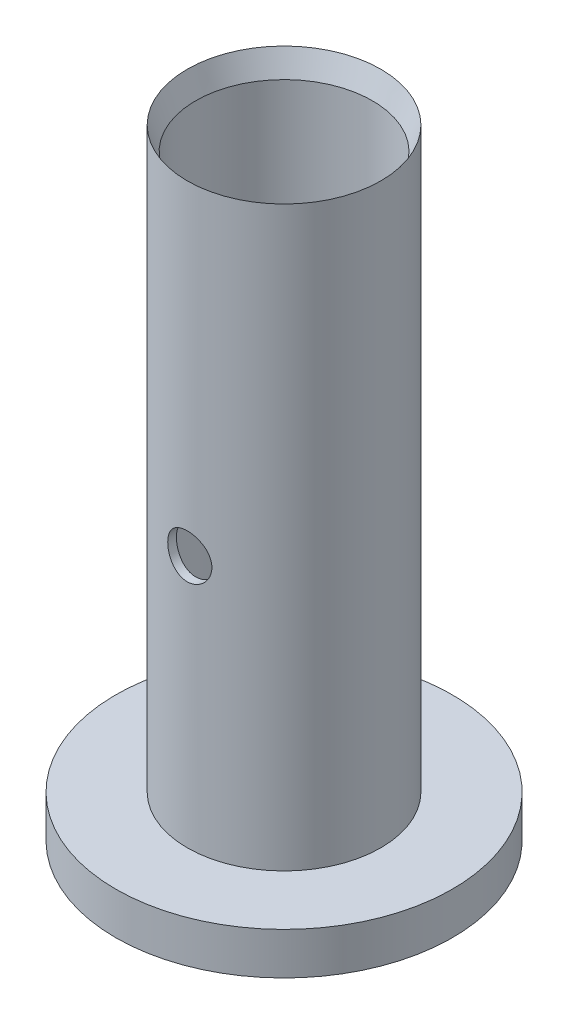
ISO-10303-21;
HEADER;
FILE_DESCRIPTION(('STEP AP214'),'2;1');
FILE_NAME('part.step','',(''),(''),'','','');
FILE_SCHEMA(('AUTOMOTIVE_DESIGN { 1 0 10303 214 1 1 1 1 }'));
ENDSEC;
DATA;
#1=APPLICATION_CONTEXT('core data for automotive mechanical design processes');
#2=APPLICATION_PROTOCOL_DEFINITION('international standard','automotive_design',2000,#1);
#3=PRODUCT_CONTEXT('',#1,'mechanical');
#4=PRODUCT('Part','Part','',(#3));
#5=PRODUCT_RELATED_PRODUCT_CATEGORY('part','',(#4));
#6=PRODUCT_DEFINITION_FORMATION('','',#4);
#7=PRODUCT_DEFINITION_CONTEXT('part definition',#1,'design');
#8=PRODUCT_DEFINITION('design','',#6,#7);
#9=PRODUCT_DEFINITION_SHAPE('','',#8);
#10=(LENGTH_UNIT() NAMED_UNIT(*) SI_UNIT(.MILLI.,.METRE.));
#11=(NAMED_UNIT(*) PLANE_ANGLE_UNIT() SI_UNIT($,.RADIAN.));
#12=(NAMED_UNIT(*) SI_UNIT($,.STERADIAN.) SOLID_ANGLE_UNIT());
#13=UNCERTAINTY_MEASURE_WITH_UNIT(LENGTH_MEASURE(1.E-05),#10,'distance_accuracy_value','');
#14=(GEOMETRIC_REPRESENTATION_CONTEXT(3) GLOBAL_UNCERTAINTY_ASSIGNED_CONTEXT((#13)) GLOBAL_UNIT_ASSIGNED_CONTEXT((#10,
#11,#12)) REPRESENTATION_CONTEXT('',''));
#15=CARTESIAN_POINT('',(0.,0.,0.));
#16=DIRECTION('',(0.,0.,1.));
#17=DIRECTION('',(1.,0.,0.));
#18=AXIS2_PLACEMENT_3D('',#15,#16,#17);
#19=CARTESIAN_POINT('',(0.,75.,0.));
#20=DIRECTION('',(0.,-1.,0.));
#21=DIRECTION('',(0.,0.,-1.));
#22=AXIS2_PLACEMENT_3D('',#19,#20,#21);
#23=CYLINDRICAL_SURFACE('',#22,11.5);
#24=CARTESIAN_POINT('',(0.,73.6262612902726,0.));
#25=DIRECTION('',(0.,1.,0.));
#26=DIRECTION('',(0.,0.,1.));
#27=AXIS2_PLACEMENT_3D('',#24,#25,#26);
#28=CIRCLE('',#27,11.5);
#29=CARTESIAN_POINT('',(0.,73.6262612902726,11.5));
#30=VERTEX_POINT('',#29);
#31=EDGE_CURVE('E10',#30,#30,#28,.F.);
#32=ORIENTED_EDGE('',*,*,#31,.T.);
#33=EDGE_LOOP('',(#32));
#34=FACE_BOUND('',#33,.T.);
#35=CARTESIAN_POINT('',(0.,5.,0.));
#36=DIRECTION('',(0.,1.,0.));
#37=DIRECTION('',(0.,0.,1.));
#38=AXIS2_PLACEMENT_3D('',#35,#36,#37);
#39=CIRCLE('',#38,11.5);
#40=CARTESIAN_POINT('',(0.,5.,11.5));
#41=VERTEX_POINT('',#40);
#42=EDGE_CURVE('E92',#41,#41,#39,.T.);
#43=ORIENTED_EDGE('',*,*,#42,.T.);
#44=EDGE_LOOP('',(#43));
#45=FACE_BOUND('',#44,.T.);
#46=CARTESIAN_POINT('',(-2.625,35.,11.1964000911007));
#47=CARTESIAN_POINT('',(-2.62499522972335,34.8546285718836,11.1964030160776));
#48=CARTESIAN_POINT('',(-2.61288299010366,34.7092012055592,11.199262156291));
#49=CARTESIAN_POINT('',(-2.56481405771317,34.4224939435341,11.2103664272199));
#50=CARTESIAN_POINT('',(-2.52884111475512,34.2812169429384,11.2186152284742));
#51=CARTESIAN_POINT('',(-2.43425222463388,34.0069990356074,11.2395170301364));
#52=CARTESIAN_POINT('',(-2.37566239143489,33.8740487197081,11.2521649495637));
#53=CARTESIAN_POINT('',(-2.23757913098247,33.6198581743126,11.2804337167907));
#54=CARTESIAN_POINT('',(-2.15808574326685,33.498617922668,11.2960545589672));
#55=CARTESIAN_POINT('',(-1.97889357179571,33.2690597249565,11.3288300516936));
#56=CARTESIAN_POINT('',(-1.87888255545855,33.1609884721643,11.3460057854251));
#57=CARTESIAN_POINT('',(-1.66216769700499,32.9630002907655,11.3797717175111));
#58=CARTESIAN_POINT('',(-1.54546248557699,32.8730848528175,11.3963618676948));
#59=CARTESIAN_POINT('',(-1.29700743668664,32.712975016258,11.4273180770594));
#60=CARTESIAN_POINT('',(-1.16509997199527,32.6430193860532,11.4416563549652));
#61=CARTESIAN_POINT('',(-0.891018489059165,32.5263619293594,11.4662544377204));
#62=CARTESIAN_POINT('',(-0.748845729999171,32.4796572563389,11.4765147417906));
#63=CARTESIAN_POINT('',(-0.460836626639247,32.4116075725844,11.4916518149347));
#64=CARTESIAN_POINT('',(-0.315103772487172,32.3898446060749,11.4966172107089));
#65=CARTESIAN_POINT('',(-0.0219766485327435,32.3709878273046,11.5009125869178));
#66=CARTESIAN_POINT('',(0.125417412721378,32.3738909521623,11.5002432670364));
#67=CARTESIAN_POINT('',(0.414796637742551,32.4039757701748,11.4934118475429));
#68=CARTESIAN_POINT('',(0.55683141944748,32.4307067826794,11.4873517141491));
#69=CARTESIAN_POINT('',(0.834344130406138,32.5069685942023,11.4705364856204));
#70=CARTESIAN_POINT('',(0.969821746128054,32.5565004822596,11.4597811662303));
#71=CARTESIAN_POINT('',(1.23160684085522,32.677346615628,11.4346223750078));
#72=CARTESIAN_POINT('',(1.35783408165489,32.7488286219538,11.4201909574681));
#73=CARTESIAN_POINT('',(1.59666413162439,32.9114201974289,11.3892575303513));
#74=CARTESIAN_POINT('',(1.70926492792474,33.0025326608343,11.3727552155973));
#75=CARTESIAN_POINT('',(1.92032875123781,33.2042417641472,11.3390491228283));
#76=CARTESIAN_POINT('',(2.01841408606874,33.3152327423613,11.3218379220263));
#77=CARTESIAN_POINT('',(2.19465418528638,33.5522673388985,11.2890014200061));
#78=CARTESIAN_POINT('',(2.27280830737805,33.6783114421253,11.2733761699058));
#79=CARTESIAN_POINT('',(2.40715637075502,33.9425225611238,11.2454588538581));
#80=CARTESIAN_POINT('',(2.46327329660005,34.0807300620133,11.2331785227117));
#81=CARTESIAN_POINT('',(2.551367866811,34.3649617300286,11.2134999410195));
#82=CARTESIAN_POINT('',(2.58334972098315,34.510984529195,11.2061008390843));
#83=CARTESIAN_POINT('',(2.6216686899979,34.8032355153864,11.1971976539096));
#84=CARTESIAN_POINT('',(2.62855822472621,34.94938748898,11.195566607806));
#85=CARTESIAN_POINT('',(2.61799750794673,35.2407517873713,11.1980408065549));
#86=CARTESIAN_POINT('',(2.60054909056856,35.3859641821481,11.2021456191482));
#87=CARTESIAN_POINT('',(2.54228861012618,35.6693669843517,11.2155086066113));
#88=CARTESIAN_POINT('',(2.50178581764063,35.8076244886034,11.2246985210776));
#89=CARTESIAN_POINT('',(2.39890349193711,36.075390193262,11.2471337209453));
#90=CARTESIAN_POINT('',(2.33652171383671,36.2048974942317,11.2603794224711));
#91=CARTESIAN_POINT('',(2.19045302282994,36.4538626371958,11.2897092815598));
#92=CARTESIAN_POINT('',(2.10642872661217,36.5731172933585,11.3058370207324));
#93=CARTESIAN_POINT('',(1.91989720781627,36.7960368246964,11.3390012315149));
#94=CARTESIAN_POINT('',(1.81738747488924,36.8996995789579,11.3560378263272));
#95=CARTESIAN_POINT('',(1.59428465946479,37.0906640514598,11.389522124019));
#96=CARTESIAN_POINT('',(1.4733644189016,37.1775875031166,11.4059506386282));
#97=CARTESIAN_POINT('',(1.21831870121122,37.3298887288013,11.4360029115547));
#98=CARTESIAN_POINT('',(1.08419386820515,37.3952675531022,11.4496268065814));
#99=CARTESIAN_POINT('',(0.807416439204785,37.5021104699311,11.4724545031604));
#100=CARTESIAN_POINT('',(0.664827619177445,37.5437332364,11.4816875615991));
#101=CARTESIAN_POINT('',(0.374445116926178,37.6023732707065,11.4948202711569));
#102=CARTESIAN_POINT('',(0.226652266502336,37.6193944526806,11.498720770686));
#103=CARTESIAN_POINT('',(-0.0663633872726402,37.6281591216683,11.5007209249535));
#104=CARTESIAN_POINT('',(-0.21156875657118,37.6204653723092,11.4989497282092));
#105=CARTESIAN_POINT('',(-0.498558697646076,37.5812861595122,11.4900850275044));
#106=CARTESIAN_POINT('',(-0.640343341819757,37.5498012000557,11.4829916362867));
#107=CARTESIAN_POINT('',(-0.915986560885999,37.4642129103949,11.4642922415652));
#108=CARTESIAN_POINT('',(-1.04987317759539,37.4101958849367,11.4527034684973));
#109=CARTESIAN_POINT('',(-1.30675431389795,37.2811585961905,11.4262455212601));
#110=CARTESIAN_POINT('',(-1.42974767566216,37.2061361037785,11.4113759989694));
#111=CARTESIAN_POINT('',(-1.66407448167664,37.0354170415401,11.3795930657605));
#112=CARTESIAN_POINT('',(-1.77511765322422,36.9393286488217,11.3626440421488));
#113=CARTESIAN_POINT('',(-1.97969536888035,36.7299872507087,11.328794413396));
#114=CARTESIAN_POINT('',(-2.07322563266736,36.6167300613045,11.3118938210833));
#115=CARTESIAN_POINT('',(-2.24146922395788,36.3742418644859,11.2797730163259));
#116=CARTESIAN_POINT('',(-2.31588244243068,36.244798591269,11.264581489738));
#117=CARTESIAN_POINT('',(-2.44177981841721,35.9749198278726,11.2379661384042));
#118=CARTESIAN_POINT('',(-2.49328260616002,35.8344933786314,11.2265392543074));
#119=CARTESIAN_POINT('',(-2.56314049024259,35.5783573566932,11.210766152697));
#120=CARTESIAN_POINT('',(-2.58629161785856,35.4639935804003,11.2054159792806));
#121=CARTESIAN_POINT('',(-2.61722284006269,35.2330984410692,11.1982318776213));
#122=CARTESIAN_POINT('',(-2.62500382508323,35.1165672039924,11.1963977456853));
#123=CARTESIAN_POINT('',(-2.625,35.,11.1964000911007));
#124=B_SPLINE_CURVE_WITH_KNOTS('',3,(#46,#47,#48,#49,#50,#51,#52,#53,#54,#55,#56,#57,#58,#59,
#60,#61,#62,#63,#64,#65,#66,#67,#68,#69,#70,#71,#72,#73,#74,#75,#76,#77,#78,#79,#80,#81,#82,#83,
#84,#85,#86,#87,#88,#89,#90,#91,#92,#93,#94,#95,#96,#97,#98,#99,#100,#101,#102,#103,#104,#105,
#106,#107,#108,#109,#110,#111,#112,#113,#114,#115,#116,#117,#118,#119,#120,#121,#122,#123),
.UNSPECIFIED.,.T.,.F.,(4,2,2,2,2,2,2,2,2,2,2,2,2,2,2,2,2,2,2,2,2,2,2,2,2,2,2,2,2,2,2,2,2,2,2,2,
2,2,4),(0.,0.435686836516036,0.871670699988962,1.30715266528045,1.74263380689012,
2.18531241692166,2.62802735771961,3.07583525015006,3.52358830557182,3.96372317047295,
4.40380338296866,4.83573248302372,5.26768221546754,5.70301908857737,6.13842019043245,
6.58367644952291,7.02894705544512,7.47576022873211,7.92249544774774,8.35933400789817,
8.7961396492866,9.22721924020232,9.65834307477088,10.09664392049,10.5350043329802,
10.982336266561,11.4296463900547,11.8739327357761,12.3181483873157,12.7523214761353,
13.1864853679011,13.6190013307199,14.051563210029,14.4929811182136,14.9345067727171,
15.3825901463536,15.8303084799457,16.1796875806065,16.5290464402327),.UNSPECIFIED.);
#125=CARTESIAN_POINT('',(-2.625,35.,11.1964000911007));
#126=VERTEX_POINT('',#125);
#127=EDGE_CURVE('E74',#126,#126,#124,.T.);
#128=ORIENTED_EDGE('',*,*,#127,.F.);
#129=EDGE_LOOP('',(#128));
#130=FACE_BOUND('',#129,.T.);
#131=ADVANCED_FACE('F44',(#34,#45,#130),#23,.T.);
#132=CARTESIAN_POINT('',(0.,75.,0.));
#133=DIRECTION('',(0.,-1.,0.));
#134=DIRECTION('',(0.,0.,-1.));
#135=AXIS2_PLACEMENT_3D('',#132,#133,#134);
#136=CYLINDRICAL_SURFACE('',#135,10.5);
#137=CARTESIAN_POINT('',(0.,70.8787838708179,0.));
#138=DIRECTION('',(0.,1.,0.));
#139=DIRECTION('',(0.,0.,1.));
#140=AXIS2_PLACEMENT_3D('',#137,#138,#139);
#141=CIRCLE('',#140,10.5);
#142=CARTESIAN_POINT('',(0.,70.8787838708179,10.5));
#143=VERTEX_POINT('',#142);
#144=EDGE_CURVE('E53',#143,#143,#141,.T.);
#145=ORIENTED_EDGE('',*,*,#144,.T.);
#146=EDGE_LOOP('',(#145));
#147=FACE_BOUND('',#146,.T.);
#148=CARTESIAN_POINT('',(0.,5.,0.));
#149=DIRECTION('',(0.,1.,0.));
#150=DIRECTION('',(0.,0.,1.));
#151=AXIS2_PLACEMENT_3D('',#148,#149,#150);
#152=CIRCLE('',#151,10.5);
#153=CARTESIAN_POINT('',(0.,5.,10.5));
#154=VERTEX_POINT('',#153);
#155=EDGE_CURVE('E58',#154,#154,#152,.F.);
#156=ORIENTED_EDGE('',*,*,#155,.T.);
#157=EDGE_LOOP('',(#156));
#158=FACE_BOUND('',#157,.T.);
#159=CARTESIAN_POINT('',(-2.625,35.,10.1665812837945));
#160=CARTESIAN_POINT('',(-2.62499588252273,34.8550467115271,10.1665840509225));
#161=CARTESIAN_POINT('',(-2.61295255777253,34.7100478563876,10.1697152131533));
#162=CARTESIAN_POINT('',(-2.56517428173698,34.4242140429178,10.1818695509219));
#163=CARTESIAN_POINT('',(-2.52942554207921,34.2833815578084,10.1908961555271));
#164=CARTESIAN_POINT('',(-2.43546575961364,34.0100562849035,10.2137566082596));
#165=CARTESIAN_POINT('',(-2.37728371424722,33.877552986845,10.2275842482498));
#166=CARTESIAN_POINT('',(-2.24019719832446,33.6241736048331,10.258481016302));
#167=CARTESIAN_POINT('',(-2.16129184798872,33.5032980148158,10.2755502819741));
#168=CARTESIAN_POINT('',(-1.98314384867748,33.2739452724747,10.3114275217341));
#169=CARTESIAN_POINT('',(-1.88352873208925,33.1657617196324,10.3302632750419));
#170=CARTESIAN_POINT('',(-1.6675911673057,32.9674505359216,10.3673101929106));
#171=CARTESIAN_POINT('',(-1.55126715888932,32.8773245930972,10.3855212989471));
#172=CARTESIAN_POINT('',(-1.3032024611329,32.7164857589872,10.4195743629661));
#173=CARTESIAN_POINT('',(-1.17126930500488,32.6460612924305,10.4353797177062));
#174=CARTESIAN_POINT('',(-0.8969763435074,32.5284998736393,10.4625235252228));
#175=CARTESIAN_POINT('',(-0.754618080081539,32.4813594854887,10.4738626370106));
#176=CARTESIAN_POINT('',(-0.466576696691873,32.4126447736925,10.4905999679059));
#177=CARTESIAN_POINT('',(-0.321019355526427,32.3905718734571,10.4961138853653));
#178=CARTESIAN_POINT('',(-0.0281702602259099,32.3710537017607,10.5009827381266));
#179=CARTESIAN_POINT('',(0.11912123426497,32.3736047891799,10.5003385840154));
#180=CARTESIAN_POINT('',(0.407799648827515,32.4029035927627,10.4930499970121));
#181=CARTESIAN_POINT('',(0.549245065952798,32.4291131413066,10.4865390245791));
#182=CARTESIAN_POINT('',(0.825662899460925,32.5041198335509,10.468403783511));
#183=CARTESIAN_POINT('',(0.960634970847399,32.5529181796463,10.4567792426837));
#184=CARTESIAN_POINT('',(1.22169259669224,32.6721526992214,10.4295188518593));
#185=CARTESIAN_POINT('',(1.34768683813707,32.7427803968948,10.4138477067976));
#186=CARTESIAN_POINT('',(1.58622350864378,32.9035234630721,10.3801939900018));
#187=CARTESIAN_POINT('',(1.69876359209945,32.9936422219887,10.3622110163528));
#188=CARTESIAN_POINT('',(1.91040684209801,33.1936941790815,10.3253189945782));
#189=CARTESIAN_POINT('',(2.00906390757239,33.3040976369651,10.3063980550156));
#190=CARTESIAN_POINT('',(2.18656298690293,33.5400799722173,10.2702079569319));
#191=CARTESIAN_POINT('',(2.26540407462082,33.6656595584657,10.252938875637));
#192=CARTESIAN_POINT('',(2.40131883868429,33.9293045358563,10.2219652167078));
#193=CARTESIAN_POINT('',(2.45828511329743,34.0674275168285,10.2082783290286));
#194=CARTESIAN_POINT('',(2.5480497541705,34.3517147414807,10.186245721561));
#195=CARTESIAN_POINT('',(2.58085329220179,34.4978772571838,10.1778988588487));
#196=CARTESIAN_POINT('',(2.62062112059922,34.7899574766064,10.1677312380783));
#197=CARTESIAN_POINT('',(2.62824499761508,34.9357796830081,10.1657439342578));
#198=CARTESIAN_POINT('',(2.61924284004092,35.2266130334145,10.1680671053293));
#199=CARTESIAN_POINT('',(2.60261903774229,35.3716242508469,10.1723770004882));
#200=CARTESIAN_POINT('',(2.54617173713517,35.654269978196,10.1866493608423));
#201=CARTESIAN_POINT('',(2.506732271696,35.7919863628977,10.1965181875466));
#202=CARTESIAN_POINT('',(2.40619898575398,36.058853030746,10.2207075417595));
#203=CARTESIAN_POINT('',(2.34510260009812,36.1880022970086,10.2350285965873));
#204=CARTESIAN_POINT('',(2.20160920133343,36.4368633417602,10.2668594395029));
#205=CARTESIAN_POINT('',(2.11881784152742,36.5563402820451,10.2844262703761));
#206=CARTESIAN_POINT('',(1.93478326895294,36.7799477809416,10.3206293722467));
#207=CARTESIAN_POINT('',(1.83353702386428,36.8840758124826,10.3392658186472));
#208=CARTESIAN_POINT('',(1.61243964258491,37.0767015946995,10.3760727318336));
#209=CARTESIAN_POINT('',(1.49218637539544,37.1647430656762,10.3942198716497));
#210=CARTESIAN_POINT('',(1.23821954207352,37.3193826602988,10.4275207744437));
#211=CARTESIAN_POINT('',(1.10450667851368,37.3859819024386,10.4426746935415));
#212=CARTESIAN_POINT('',(0.828340279544114,37.4952683362543,10.4681862152524));
#213=CARTESIAN_POINT('',(0.685958125198193,37.538127498598,10.4785782152353));
#214=CARTESIAN_POINT('',(0.39571812083687,37.5992333513388,10.4935455806558));
#215=CARTESIAN_POINT('',(0.247861333233258,37.617484791676,10.4981220686309));
#216=CARTESIAN_POINT('',(-0.0448442569137214,37.6285899226358,10.5008969469812));
#217=CARTESIAN_POINT('',(-0.189666295785805,37.6221169863755,10.4992644455997));
#218=CARTESIAN_POINT('',(-0.476089678088719,37.5854994533523,10.4901797820079));
#219=CARTESIAN_POINT('',(-0.617691117174936,37.5553555605904,10.4827277928757));
#220=CARTESIAN_POINT('',(-0.892948968567531,37.4726129231015,10.4628676124146));
#221=CARTESIAN_POINT('',(-1.02664404827476,37.4201359350498,10.4504863181878));
#222=CARTESIAN_POINT('',(-1.28340726423426,37.2943272300736,10.4220713339835));
#223=CARTESIAN_POINT('',(-1.40647405832229,37.22099288424,10.4060371836424));
#224=CARTESIAN_POINT('',(-1.64168006211117,37.0534975107602,10.3715653041075));
#225=CARTESIAN_POINT('',(-1.75348684428313,36.9588796248775,10.3530791947187));
#226=CARTESIAN_POINT('',(-1.95986442821795,36.7523900135595,10.3160045377512));
#227=CARTESIAN_POINT('',(-2.05443085332605,36.6405139202082,10.2974159653917));
#228=CARTESIAN_POINT('',(-2.22537531948856,36.4001712877527,10.2618462409444));
#229=CARTESIAN_POINT('',(-2.30138112596799,36.2714341761662,10.2449015464238));
#230=CARTESIAN_POINT('',(-2.43055810353686,36.0026043390786,10.2150288317392));
#231=CARTESIAN_POINT('',(-2.4837458880994,35.8625199640037,10.2020978911219));
#232=CARTESIAN_POINT('',(-2.55785913749888,35.6022353439327,10.1837376047069));
#233=CARTESIAN_POINT('',(-2.58298207281681,35.4832804434864,10.1773524038418));
#234=CARTESIAN_POINT('',(-2.6165535180009,35.2428942188811,10.1687732627938));
#235=CARTESIAN_POINT('',(-2.62500345022584,35.1214631068584,10.1665789650891));
#236=CARTESIAN_POINT('',(-2.625,35.,10.1665812837945));
#237=B_SPLINE_CURVE_WITH_KNOTS('',3,(#159,#160,#161,#162,#163,#164,#165,#166,#167,#168,#169,
#170,#171,#172,#173,#174,#175,#176,#177,#178,#179,#180,#181,#182,#183,#184,#185,#186,#187,#188,
#189,#190,#191,#192,#193,#194,#195,#196,#197,#198,#199,#200,#201,#202,#203,#204,#205,#206,#207,
#208,#209,#210,#211,#212,#213,#214,#215,#216,#217,#218,#219,#220,#221,#222,#223,#224,#225,#226,
#227,#228,#229,#230,#231,#232,#233,#234,#235,#236),.UNSPECIFIED.,.T.,.F.,(4,2,2,2,2,2,2,2,2,2,2,
2,2,2,2,2,2,2,2,2,2,2,2,2,2,2,2,2,2,2,2,2,2,2,2,2,2,2,4),(0.,0.43441381382294,0.869080528500098,
1.30318726352432,1.73731243093252,2.18005151902625,2.6228319755386,3.07179071217816,
3.52068317839447,3.96048188545114,4.40021556099322,4.83019175823394,5.26019084561025,
5.69407517967167,6.12803504742359,6.57373989900508,7.01946557759793,7.46735253608823,
7.91514360136025,8.35110753502414,8.78703133548184,9.2158227526486,9.64466497497682,
10.0819198815731,10.5192466983449,10.9675159751878,11.4157618651072,11.8607167645247,
12.3055857635968,12.7384261843902,13.1712537325102,13.6017512039289,14.0323029603017,
14.4731695141637,14.9141478314898,15.3633530115569,15.8122305744377,16.1762771854501,
16.5402927386331),.UNSPECIFIED.);
#238=CARTESIAN_POINT('',(-2.625,35.,10.1665812837945));
#239=VERTEX_POINT('',#238);
#240=EDGE_CURVE('E66',#239,#239,#237,.T.);
#241=ORIENTED_EDGE('',*,*,#240,.T.);
#242=EDGE_LOOP('',(#241));
#243=FACE_BOUND('',#242,.T.);
#244=ADVANCED_FACE('F76',(#147,#158,#243),#136,.F.);
#245=CARTESIAN_POINT('',(0.,5.,0.));
#246=DIRECTION('',(0.,-1.,0.));
#247=DIRECTION('',(0.,0.,-1.));
#248=AXIS2_PLACEMENT_3D('',#245,#246,#247);
#249=CYLINDRICAL_SURFACE('',#248,20.);
#250=CARTESIAN_POINT('',(0.,5.,0.));
#251=DIRECTION('',(0.,1.,0.));
#252=DIRECTION('',(0.,0.,1.));
#253=AXIS2_PLACEMENT_3D('',#250,#251,#252);
#254=CIRCLE('',#253,20.);
#255=CARTESIAN_POINT('',(0.,5.,20.));
#256=VERTEX_POINT('',#255);
#257=EDGE_CURVE('E63',#256,#256,#254,.T.);
#258=ORIENTED_EDGE('',*,*,#257,.F.);
#259=EDGE_LOOP('',(#258));
#260=FACE_BOUND('',#259,.T.);
#261=CARTESIAN_POINT('',(0.,0.,0.));
#262=DIRECTION('',(0.,1.,0.));
#263=DIRECTION('',(0.,0.,1.));
#264=AXIS2_PLACEMENT_3D('',#261,#262,#263);
#265=CIRCLE('',#264,20.);
#266=CARTESIAN_POINT('',(0.,0.,20.));
#267=VERTEX_POINT('',#266);
#268=EDGE_CURVE('E115',#267,#267,#265,.T.);
#269=ORIENTED_EDGE('',*,*,#268,.T.);
#270=EDGE_LOOP('',(#269));
#271=FACE_BOUND('',#270,.T.);
#272=ADVANCED_FACE('F101',(#260,#271),#249,.T.);
#273=CARTESIAN_POINT('',(0.,5.,0.));
#274=DIRECTION('',(0.,1.,0.));
#275=DIRECTION('',(0.,0.,1.));
#276=AXIS2_PLACEMENT_3D('',#273,#274,#275);
#277=PLANE('',#276);
#278=ORIENTED_EDGE('',*,*,#42,.F.);
#279=EDGE_LOOP('',(#278));
#280=FACE_BOUND('',#279,.T.);
#281=ORIENTED_EDGE('',*,*,#257,.T.);
#282=EDGE_LOOP('',(#281));
#283=FACE_BOUND('',#282,.T.);
#284=ADVANCED_FACE('F97',(#280,#283),#277,.T.);
#285=CARTESIAN_POINT('',(0.,0.,0.));
#286=DIRECTION('',(0.,1.,0.));
#287=DIRECTION('',(0.,0.,1.));
#288=AXIS2_PLACEMENT_3D('',#285,#286,#287);
#289=PLANE('',#288);
#290=ORIENTED_EDGE('',*,*,#268,.F.);
#291=EDGE_LOOP('',(#290));
#292=FACE_BOUND('',#291,.T.);
#293=ADVANCED_FACE('F100',(#292),#289,.F.);
#294=ORIENTED_EDGE('',*,*,#155,.F.);
#295=EDGE_LOOP('',(#294));
#296=FACE_BOUND('',#295,.T.);
#297=ADVANCED_FACE('F82',(#296),#277,.T.);
#298=CARTESIAN_POINT('',(0.,35.,20.));
#299=DIRECTION('',(0.,0.,-1.));
#300=DIRECTION('',(-1.,0.,0.));
#301=AXIS2_PLACEMENT_3D('',#298,#299,#300);
#302=CYLINDRICAL_SURFACE('',#301,2.625);
#303=ORIENTED_EDGE('',*,*,#240,.F.);
#304=EDGE_LOOP('',(#303));
#305=FACE_BOUND('',#304,.T.);
#306=ORIENTED_EDGE('',*,*,#127,.T.);
#307=EDGE_LOOP('',(#306));
#308=FACE_BOUND('',#307,.T.);
#309=ADVANCED_FACE('F79',(#305,#308),#302,.F.);
#310=CARTESIAN_POINT('',(0.,70.8787838708179,0.));
#311=DIRECTION('',(0.,1.,0.));
#312=DIRECTION('',(0.,0.,1.));
#313=AXIS2_PLACEMENT_3D('',#310,#311,#312);
#314=CONICAL_SURFACE('',#313,10.5,0.349065850398862);
#315=ORIENTED_EDGE('',*,*,#31,.F.);
#316=EDGE_LOOP('',(#315));
#317=FACE_BOUND('',#316,.T.);
#318=ORIENTED_EDGE('',*,*,#144,.F.);
#319=EDGE_LOOP('',(#318));
#320=FACE_BOUND('',#319,.T.);
#321=ADVANCED_FACE('F47',(#317,#320),#314,.F.);
#322=CLOSED_SHELL('',(#131,#244,#272,#284,#293,#297,#309,#321));
#323=MANIFOLD_SOLID_BREP('B2',#322);
#324=ADVANCED_BREP_SHAPE_REPRESENTATION('',(#18,#323),#14);
#325=SHAPE_DEFINITION_REPRESENTATION(#9,#324);
ENDSEC;
END-ISO-10303-21;
